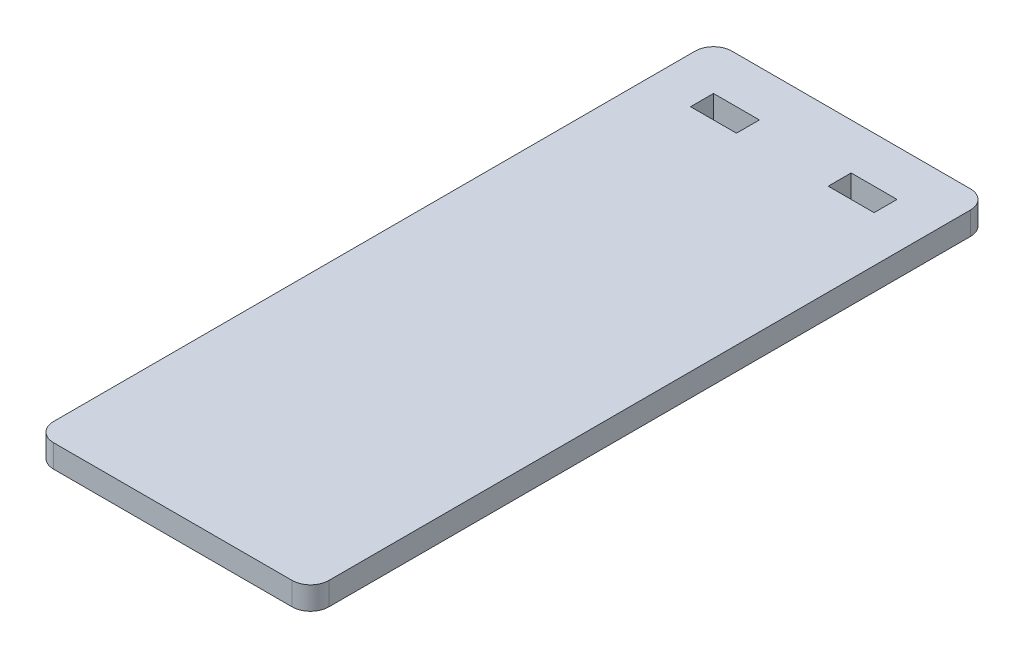
ISO-10303-21;
HEADER;
FILE_DESCRIPTION(('STEP AP214'),'2;1');
FILE_NAME('part.step','',(''),(''),'','','');
FILE_SCHEMA(('AUTOMOTIVE_DESIGN { 1 0 10303 214 1 1 1 1 }'));
ENDSEC;
DATA;
#1=APPLICATION_CONTEXT('core data for automotive mechanical design processes');
#2=APPLICATION_PROTOCOL_DEFINITION('international standard','automotive_design',2000,#1);
#3=PRODUCT_CONTEXT('',#1,'mechanical');
#4=PRODUCT('Part','Part','',(#3));
#5=PRODUCT_RELATED_PRODUCT_CATEGORY('part','',(#4));
#6=PRODUCT_DEFINITION_FORMATION('','',#4);
#7=PRODUCT_DEFINITION_CONTEXT('part definition',#1,'design');
#8=PRODUCT_DEFINITION('design','',#6,#7);
#9=PRODUCT_DEFINITION_SHAPE('','',#8);
#10=(LENGTH_UNIT() NAMED_UNIT(*) SI_UNIT(.MILLI.,.METRE.));
#11=(NAMED_UNIT(*) PLANE_ANGLE_UNIT() SI_UNIT($,.RADIAN.));
#12=(NAMED_UNIT(*) SI_UNIT($,.STERADIAN.) SOLID_ANGLE_UNIT());
#13=UNCERTAINTY_MEASURE_WITH_UNIT(LENGTH_MEASURE(1.E-05),#10,'distance_accuracy_value','');
#14=(GEOMETRIC_REPRESENTATION_CONTEXT(3) GLOBAL_UNCERTAINTY_ASSIGNED_CONTEXT((#13)) GLOBAL_UNIT_ASSIGNED_CONTEXT((#10,
#11,#12)) REPRESENTATION_CONTEXT('',''));
#15=CARTESIAN_POINT('',(0.,0.,0.));
#16=DIRECTION('',(0.,0.,1.));
#17=DIRECTION('',(1.,0.,0.));
#18=AXIS2_PLACEMENT_3D('',#15,#16,#17);
#19=CARTESIAN_POINT('',(0.,3.175,0.));
#20=DIRECTION('',(1.,0.,0.));
#21=DIRECTION('',(0.,0.,-1.));
#22=AXIS2_PLACEMENT_3D('',#19,#20,#21);
#23=PLANE('',#22);
#24=DIRECTION('',(0.,0.,1.));
#25=VECTOR('',#24,1.);
#26=CARTESIAN_POINT('',(0.,0.,0.));
#27=LINE('',#26,#25);
#28=CARTESIAN_POINT('',(0.,0.,-91.335));
#29=VERTEX_POINT('',#28);
#30=CARTESIAN_POINT('',(0.,0.,-2.54));
#31=VERTEX_POINT('',#30);
#32=EDGE_CURVE('E208',#29,#31,#27,.T.);
#33=ORIENTED_EDGE('',*,*,#32,.T.);
#34=DIRECTION('',(0.,-1.,0.));
#35=VECTOR('',#34,1.);
#36=CARTESIAN_POINT('',(0.,3.175,-2.54));
#37=LINE('',#36,#35);
#38=CARTESIAN_POINT('',(0.,3.175,-2.54));
#39=VERTEX_POINT('',#38);
#40=EDGE_CURVE('E326',#31,#39,#37,.F.);
#41=ORIENTED_EDGE('',*,*,#40,.T.);
#42=DIRECTION('',(0.,0.,1.));
#43=VECTOR('',#42,1.);
#44=CARTESIAN_POINT('',(0.,3.175,0.));
#45=LINE('',#44,#43);
#46=CARTESIAN_POINT('',(0.,3.175,-91.335));
#47=VERTEX_POINT('',#46);
#48=EDGE_CURVE('E257',#47,#39,#45,.T.);
#49=ORIENTED_EDGE('',*,*,#48,.F.);
#50=DIRECTION('',(0.,-1.,0.));
#51=VECTOR('',#50,1.);
#52=CARTESIAN_POINT('',(0.,3.175,-91.335));
#53=LINE('',#52,#51);
#54=EDGE_CURVE('E322',#47,#29,#53,.T.);
#55=ORIENTED_EDGE('',*,*,#54,.T.);
#56=EDGE_LOOP('',(#33,#41,#49,#55));
#57=FACE_BOUND('',#56,.T.);
#58=ADVANCED_FACE('F42',(#57),#23,.F.);
#59=CARTESIAN_POINT('',(0.,3.175,0.));
#60=DIRECTION('',(0.,0.,-1.));
#61=DIRECTION('',(-1.,0.,0.));
#62=AXIS2_PLACEMENT_3D('',#59,#60,#61);
#63=PLANE('',#62);
#64=DIRECTION('',(1.,0.,0.));
#65=VECTOR('',#64,1.);
#66=CARTESIAN_POINT('',(0.,0.,0.));
#67=LINE('',#66,#65);
#68=CARTESIAN_POINT('',(2.54,0.,0.));
#69=VERTEX_POINT('',#68);
#70=CARTESIAN_POINT('',(35.56,0.,0.));
#71=VERTEX_POINT('',#70);
#72=EDGE_CURVE('E276',#69,#71,#67,.T.);
#73=ORIENTED_EDGE('',*,*,#72,.T.);
#74=DIRECTION('',(0.,-1.,0.));
#75=VECTOR('',#74,1.);
#76=CARTESIAN_POINT('',(35.56,3.175,0.));
#77=LINE('',#76,#75);
#78=CARTESIAN_POINT('',(35.56,3.175,0.));
#79=VERTEX_POINT('',#78);
#80=EDGE_CURVE('E308',#71,#79,#77,.F.);
#81=ORIENTED_EDGE('',*,*,#80,.T.);
#82=DIRECTION('',(1.,0.,0.));
#83=VECTOR('',#82,1.);
#84=CARTESIAN_POINT('',(0.,3.175,0.));
#85=LINE('',#84,#83);
#86=CARTESIAN_POINT('',(2.54,3.175,0.));
#87=VERTEX_POINT('',#86);
#88=EDGE_CURVE('E261',#87,#79,#85,.T.);
#89=ORIENTED_EDGE('',*,*,#88,.F.);
#90=DIRECTION('',(0.,-1.,0.));
#91=VECTOR('',#90,1.);
#92=CARTESIAN_POINT('',(2.54,3.175,0.));
#93=LINE('',#92,#91);
#94=EDGE_CURVE('E304',#87,#69,#93,.T.);
#95=ORIENTED_EDGE('',*,*,#94,.T.);
#96=EDGE_LOOP('',(#73,#81,#89,#95));
#97=FACE_BOUND('',#96,.T.);
#98=ADVANCED_FACE('F343',(#97),#63,.F.);
#99=CARTESIAN_POINT('',(38.1,3.175,0.));
#100=DIRECTION('',(-1.,0.,0.));
#101=DIRECTION('',(0.,0.,1.));
#102=AXIS2_PLACEMENT_3D('',#99,#100,#101);
#103=PLANE('',#102);
#104=DIRECTION('',(0.,0.,-1.));
#105=VECTOR('',#104,1.);
#106=CARTESIAN_POINT('',(38.1,3.175,0.));
#107=LINE('',#106,#105);
#108=CARTESIAN_POINT('',(38.1,3.175,-2.54));
#109=VERTEX_POINT('',#108);
#110=CARTESIAN_POINT('',(38.1,3.175,-91.335));
#111=VERTEX_POINT('',#110);
#112=EDGE_CURVE('E266',#109,#111,#107,.T.);
#113=ORIENTED_EDGE('',*,*,#112,.F.);
#114=DIRECTION('',(0.,-1.,0.));
#115=VECTOR('',#114,1.);
#116=CARTESIAN_POINT('',(38.1,3.175,-2.54));
#117=LINE('',#116,#115);
#118=CARTESIAN_POINT('',(38.1,0.,-2.54));
#119=VERTEX_POINT('',#118);
#120=EDGE_CURVE('E288',#109,#119,#117,.T.);
#121=ORIENTED_EDGE('',*,*,#120,.T.);
#122=DIRECTION('',(0.,0.,-1.));
#123=VECTOR('',#122,1.);
#124=CARTESIAN_POINT('',(38.1,0.,0.));
#125=LINE('',#124,#123);
#126=CARTESIAN_POINT('',(38.1,0.,-91.335));
#127=VERTEX_POINT('',#126);
#128=EDGE_CURVE('E280',#119,#127,#125,.T.);
#129=ORIENTED_EDGE('',*,*,#128,.T.);
#130=DIRECTION('',(0.,-1.,0.));
#131=VECTOR('',#130,1.);
#132=CARTESIAN_POINT('',(38.1,3.175,-91.335));
#133=LINE('',#132,#131);
#134=EDGE_CURVE('E272',#127,#111,#133,.F.);
#135=ORIENTED_EDGE('',*,*,#134,.T.);
#136=EDGE_LOOP('',(#113,#121,#129,#135));
#137=FACE_BOUND('',#136,.T.);
#138=ADVANCED_FACE('F353',(#137),#103,.F.);
#139=CARTESIAN_POINT('',(0.,3.175,-93.875));
#140=DIRECTION('',(0.,0.,1.));
#141=DIRECTION('',(1.,0.,0.));
#142=AXIS2_PLACEMENT_3D('',#139,#140,#141);
#143=PLANE('',#142);
#144=DIRECTION('',(-1.,0.,0.));
#145=VECTOR('',#144,1.);
#146=CARTESIAN_POINT('',(0.,3.175,-93.875));
#147=LINE('',#146,#145);
#148=CARTESIAN_POINT('',(35.56,3.175,-93.875));
#149=VERTEX_POINT('',#148);
#150=CARTESIAN_POINT('',(2.54,3.175,-93.875));
#151=VERTEX_POINT('',#150);
#152=EDGE_CURVE('E269',#149,#151,#147,.T.);
#153=ORIENTED_EDGE('',*,*,#152,.F.);
#154=DIRECTION('',(0.,-1.,0.));
#155=VECTOR('',#154,1.);
#156=CARTESIAN_POINT('',(35.56,3.175,-93.875));
#157=LINE('',#156,#155);
#158=CARTESIAN_POINT('',(35.56,0.,-93.875));
#159=VERTEX_POINT('',#158);
#160=EDGE_CURVE('E11',#149,#159,#157,.T.);
#161=ORIENTED_EDGE('',*,*,#160,.T.);
#162=DIRECTION('',(-1.,0.,0.));
#163=VECTOR('',#162,1.);
#164=CARTESIAN_POINT('',(0.,0.,-93.875));
#165=LINE('',#164,#163);
#166=CARTESIAN_POINT('',(2.54,0.,-93.875));
#167=VERTEX_POINT('',#166);
#168=EDGE_CURVE('E262',#159,#167,#165,.T.);
#169=ORIENTED_EDGE('',*,*,#168,.T.);
#170=DIRECTION('',(0.,-1.,0.));
#171=VECTOR('',#170,1.);
#172=CARTESIAN_POINT('',(2.54,3.175,-93.875));
#173=LINE('',#172,#171);
#174=EDGE_CURVE('E51',#167,#151,#173,.F.);
#175=ORIENTED_EDGE('',*,*,#174,.T.);
#176=EDGE_LOOP('',(#153,#161,#169,#175));
#177=FACE_BOUND('',#176,.T.);
#178=ADVANCED_FACE('F359',(#177),#143,.F.);
#179=CARTESIAN_POINT('',(0.,3.175,0.));
#180=DIRECTION('',(0.,-1.,0.));
#181=DIRECTION('',(0.,0.,-1.));
#182=AXIS2_PLACEMENT_3D('',#179,#180,#181);
#183=PLANE('',#182);
#184=DIRECTION('',(1.,0.,0.));
#185=VECTOR('',#184,1.);
#186=CARTESIAN_POINT('',(6.35,3.175,-84.35));
#187=LINE('',#186,#185);
#188=CARTESIAN_POINT('',(6.35,3.175,-84.35));
#189=VERTEX_POINT('',#188);
#190=CARTESIAN_POINT('',(12.7,3.175,-84.35));
#191=VERTEX_POINT('',#190);
#192=EDGE_CURVE('E198',#189,#191,#187,.T.);
#193=ORIENTED_EDGE('',*,*,#192,.F.);
#194=DIRECTION('',(0.,0.,1.));
#195=VECTOR('',#194,1.);
#196=CARTESIAN_POINT('',(6.35,3.175,-87.525));
#197=LINE('',#196,#195);
#198=CARTESIAN_POINT('',(6.35,3.175,-87.525));
#199=VERTEX_POINT('',#198);
#200=EDGE_CURVE('E164',#199,#189,#197,.T.);
#201=ORIENTED_EDGE('',*,*,#200,.F.);
#202=DIRECTION('',(-1.,0.,0.));
#203=VECTOR('',#202,1.);
#204=CARTESIAN_POINT('',(6.35,3.175,-87.525));
#205=LINE('',#204,#203);
#206=CARTESIAN_POINT('',(12.7,3.175,-87.525));
#207=VERTEX_POINT('',#206);
#208=EDGE_CURVE('E185',#207,#199,#205,.T.);
#209=ORIENTED_EDGE('',*,*,#208,.F.);
#210=DIRECTION('',(0.,0.,-1.));
#211=VECTOR('',#210,1.);
#212=CARTESIAN_POINT('',(12.7,3.175,-87.525));
#213=LINE('',#212,#211);
#214=EDGE_CURVE('E189',#191,#207,#213,.T.);
#215=ORIENTED_EDGE('',*,*,#214,.F.);
#216=EDGE_LOOP('',(#193,#201,#209,#215));
#217=FACE_BOUND('',#216,.T.);
#218=DIRECTION('',(1.,0.,0.));
#219=VECTOR('',#218,1.);
#220=CARTESIAN_POINT('',(25.4,3.175,-84.35));
#221=LINE('',#220,#219);
#222=CARTESIAN_POINT('',(25.4,3.175,-84.35));
#223=VERTEX_POINT('',#222);
#224=CARTESIAN_POINT('',(31.75,3.175,-84.35));
#225=VERTEX_POINT('',#224);
#226=EDGE_CURVE('E237',#223,#225,#221,.T.);
#227=ORIENTED_EDGE('',*,*,#226,.F.);
#228=DIRECTION('',(0.,0.,1.));
#229=VECTOR('',#228,1.);
#230=CARTESIAN_POINT('',(25.4,3.175,-84.35));
#231=LINE('',#230,#229);
#232=CARTESIAN_POINT('',(25.4,3.175,-87.525));
#233=VERTEX_POINT('',#232);
#234=EDGE_CURVE('E199',#233,#223,#231,.T.);
#235=ORIENTED_EDGE('',*,*,#234,.F.);
#236=DIRECTION('',(-1.,0.,0.));
#237=VECTOR('',#236,1.);
#238=CARTESIAN_POINT('',(25.4,3.175,-87.525));
#239=LINE('',#238,#237);
#240=CARTESIAN_POINT('',(31.75,3.175,-87.525));
#241=VERTEX_POINT('',#240);
#242=EDGE_CURVE('E228',#241,#233,#239,.T.);
#243=ORIENTED_EDGE('',*,*,#242,.F.);
#244=DIRECTION('',(0.,0.,-1.));
#245=VECTOR('',#244,1.);
#246=CARTESIAN_POINT('',(31.75,3.175,-84.35));
#247=LINE('',#246,#245);
#248=EDGE_CURVE('E232',#225,#241,#247,.T.);
#249=ORIENTED_EDGE('',*,*,#248,.F.);
#250=EDGE_LOOP('',(#227,#235,#243,#249));
#251=FACE_BOUND('',#250,.T.);
#252=ORIENTED_EDGE('',*,*,#88,.T.);
#253=CARTESIAN_POINT('',(35.56,3.175,-2.54));
#254=DIRECTION('',(0.,-1.,0.));
#255=DIRECTION('',(0.,0.,-1.));
#256=AXIS2_PLACEMENT_3D('',#253,#254,#255);
#257=CIRCLE('',#256,2.54);
#258=EDGE_CURVE('E319',#79,#109,#257,.F.);
#259=ORIENTED_EDGE('',*,*,#258,.T.);
#260=ORIENTED_EDGE('',*,*,#112,.T.);
#261=CARTESIAN_POINT('',(35.56,3.175,-91.335));
#262=DIRECTION('',(0.,-1.,0.));
#263=DIRECTION('',(0.,0.,-1.));
#264=AXIS2_PLACEMENT_3D('',#261,#262,#263);
#265=CIRCLE('',#264,2.54);
#266=EDGE_CURVE('E64',#111,#149,#265,.F.);
#267=ORIENTED_EDGE('',*,*,#266,.T.);
#268=ORIENTED_EDGE('',*,*,#152,.T.);
#269=CARTESIAN_POINT('',(2.54,3.175,-91.335));
#270=DIRECTION('',(0.,-1.,0.));
#271=DIRECTION('',(0.,0.,-1.));
#272=AXIS2_PLACEMENT_3D('',#269,#270,#271);
#273=CIRCLE('',#272,2.54);
#274=EDGE_CURVE('E311',#151,#47,#273,.F.);
#275=ORIENTED_EDGE('',*,*,#274,.T.);
#276=ORIENTED_EDGE('',*,*,#48,.T.);
#277=CARTESIAN_POINT('',(2.54,3.175,-2.54));
#278=DIRECTION('',(0.,-1.,0.));
#279=DIRECTION('',(0.,0.,-1.));
#280=AXIS2_PLACEMENT_3D('',#277,#278,#279);
#281=CIRCLE('',#280,2.54);
#282=EDGE_CURVE('E316',#39,#87,#281,.F.);
#283=ORIENTED_EDGE('',*,*,#282,.T.);
#284=EDGE_LOOP('',(#252,#259,#260,#267,#268,#275,#276,#283));
#285=FACE_BOUND('',#284,.T.);
#286=ADVANCED_FACE('F336',(#217,#251,#285),#183,.F.);
#287=CARTESIAN_POINT('',(0.,0.,0.));
#288=DIRECTION('',(0.,-1.,0.));
#289=DIRECTION('',(0.,0.,-1.));
#290=AXIS2_PLACEMENT_3D('',#287,#288,#289);
#291=PLANE('',#290);
#292=DIRECTION('',(0.,0.,1.));
#293=VECTOR('',#292,1.);
#294=CARTESIAN_POINT('',(6.35,0.,-87.525));
#295=LINE('',#294,#293);
#296=CARTESIAN_POINT('',(6.35,0.,-87.525));
#297=VERTEX_POINT('',#296);
#298=CARTESIAN_POINT('',(6.35,0.,-84.35));
#299=VERTEX_POINT('',#298);
#300=EDGE_CURVE('E161',#297,#299,#295,.T.);
#301=ORIENTED_EDGE('',*,*,#300,.T.);
#302=DIRECTION('',(1.,0.,0.));
#303=VECTOR('',#302,1.);
#304=CARTESIAN_POINT('',(6.35,0.,-84.35));
#305=LINE('',#304,#303);
#306=CARTESIAN_POINT('',(12.7,0.,-84.35));
#307=VERTEX_POINT('',#306);
#308=EDGE_CURVE('E174',#299,#307,#305,.T.);
#309=ORIENTED_EDGE('',*,*,#308,.T.);
#310=DIRECTION('',(0.,0.,-1.));
#311=VECTOR('',#310,1.);
#312=CARTESIAN_POINT('',(12.7,0.,-87.525));
#313=LINE('',#312,#311);
#314=CARTESIAN_POINT('',(12.7,0.,-87.525));
#315=VERTEX_POINT('',#314);
#316=EDGE_CURVE('E179',#307,#315,#313,.T.);
#317=ORIENTED_EDGE('',*,*,#316,.T.);
#318=DIRECTION('',(-1.,0.,0.));
#319=VECTOR('',#318,1.);
#320=CARTESIAN_POINT('',(6.35,0.,-87.525));
#321=LINE('',#320,#319);
#322=EDGE_CURVE('E170',#315,#297,#321,.T.);
#323=ORIENTED_EDGE('',*,*,#322,.T.);
#324=EDGE_LOOP('',(#301,#309,#317,#323));
#325=FACE_BOUND('',#324,.T.);
#326=DIRECTION('',(0.,0.,1.));
#327=VECTOR('',#326,1.);
#328=CARTESIAN_POINT('',(25.4,0.,-84.35));
#329=LINE('',#328,#327);
#330=CARTESIAN_POINT('',(25.4,0.,-87.525));
#331=VERTEX_POINT('',#330);
#332=CARTESIAN_POINT('',(25.4,0.,-84.35));
#333=VERTEX_POINT('',#332);
#334=EDGE_CURVE('E233',#331,#333,#329,.T.);
#335=ORIENTED_EDGE('',*,*,#334,.T.);
#336=DIRECTION('',(1.,0.,0.));
#337=VECTOR('',#336,1.);
#338=CARTESIAN_POINT('',(25.4,0.,-84.35));
#339=LINE('',#338,#337);
#340=CARTESIAN_POINT('',(31.75,0.,-84.35));
#341=VERTEX_POINT('',#340);
#342=EDGE_CURVE('E250',#333,#341,#339,.T.);
#343=ORIENTED_EDGE('',*,*,#342,.T.);
#344=DIRECTION('',(0.,0.,-1.));
#345=VECTOR('',#344,1.);
#346=CARTESIAN_POINT('',(31.75,0.,-84.35));
#347=LINE('',#346,#345);
#348=CARTESIAN_POINT('',(31.75,0.,-87.525));
#349=VERTEX_POINT('',#348);
#350=EDGE_CURVE('E246',#341,#349,#347,.T.);
#351=ORIENTED_EDGE('',*,*,#350,.T.);
#352=DIRECTION('',(-1.,0.,0.));
#353=VECTOR('',#352,1.);
#354=CARTESIAN_POINT('',(25.4,0.,-87.525));
#355=LINE('',#354,#353);
#356=EDGE_CURVE('E218',#349,#331,#355,.T.);
#357=ORIENTED_EDGE('',*,*,#356,.T.);
#358=EDGE_LOOP('',(#335,#343,#351,#357));
#359=FACE_BOUND('',#358,.T.);
#360=ORIENTED_EDGE('',*,*,#128,.F.);
#361=CARTESIAN_POINT('',(35.56,0.,-2.54));
#362=DIRECTION('',(0.,-1.,0.));
#363=DIRECTION('',(0.,0.,-1.));
#364=AXIS2_PLACEMENT_3D('',#361,#362,#363);
#365=CIRCLE('',#364,2.54);
#366=EDGE_CURVE('E301',#119,#71,#365,.T.);
#367=ORIENTED_EDGE('',*,*,#366,.T.);
#368=ORIENTED_EDGE('',*,*,#72,.F.);
#369=CARTESIAN_POINT('',(2.54,0.,-2.54));
#370=DIRECTION('',(0.,-1.,0.));
#371=DIRECTION('',(0.,0.,-1.));
#372=AXIS2_PLACEMENT_3D('',#369,#370,#371);
#373=CIRCLE('',#372,2.54);
#374=EDGE_CURVE('E298',#69,#31,#373,.T.);
#375=ORIENTED_EDGE('',*,*,#374,.T.);
#376=ORIENTED_EDGE('',*,*,#32,.F.);
#377=CARTESIAN_POINT('',(2.54,0.,-91.335));
#378=DIRECTION('',(0.,-1.,0.));
#379=DIRECTION('',(0.,0.,-1.));
#380=AXIS2_PLACEMENT_3D('',#377,#378,#379);
#381=CIRCLE('',#380,2.54);
#382=EDGE_CURVE('E292',#29,#167,#381,.T.);
#383=ORIENTED_EDGE('',*,*,#382,.T.);
#384=ORIENTED_EDGE('',*,*,#168,.F.);
#385=CARTESIAN_POINT('',(35.56,0.,-91.335));
#386=DIRECTION('',(0.,-1.,0.));
#387=DIRECTION('',(0.,0.,-1.));
#388=AXIS2_PLACEMENT_3D('',#385,#386,#387);
#389=CIRCLE('',#388,2.54);
#390=EDGE_CURVE('E295',#159,#127,#389,.T.);
#391=ORIENTED_EDGE('',*,*,#390,.T.);
#392=EDGE_LOOP('',(#360,#367,#368,#375,#376,#383,#384,#391));
#393=FACE_BOUND('',#392,.T.);
#394=ADVANCED_FACE('F181',(#325,#359,#393),#291,.T.);
#395=CARTESIAN_POINT('',(25.4,0.,-84.35));
#396=DIRECTION('',(-1.,0.,0.));
#397=DIRECTION('',(0.,0.,1.));
#398=AXIS2_PLACEMENT_3D('',#395,#396,#397);
#399=PLANE('',#398);
#400=ORIENTED_EDGE('',*,*,#234,.T.);
#401=DIRECTION('',(0.,1.,0.));
#402=VECTOR('',#401,1.);
#403=CARTESIAN_POINT('',(25.4,0.,-84.35));
#404=LINE('',#403,#402);
#405=EDGE_CURVE('E214',#333,#223,#404,.T.);
#406=ORIENTED_EDGE('',*,*,#405,.F.);
#407=ORIENTED_EDGE('',*,*,#334,.F.);
#408=DIRECTION('',(0.,1.,0.));
#409=VECTOR('',#408,1.);
#410=CARTESIAN_POINT('',(25.4,0.,-87.525));
#411=LINE('',#410,#409);
#412=EDGE_CURVE('E225',#331,#233,#411,.T.);
#413=ORIENTED_EDGE('',*,*,#412,.T.);
#414=EDGE_LOOP('',(#400,#406,#407,#413));
#415=FACE_BOUND('',#414,.T.);
#416=ADVANCED_FACE('F467',(#415),#399,.F.);
#417=CARTESIAN_POINT('',(25.4,0.,-87.525));
#418=DIRECTION('',(0.,0.,-1.));
#419=DIRECTION('',(-1.,0.,0.));
#420=AXIS2_PLACEMENT_3D('',#417,#418,#419);
#421=PLANE('',#420);
#422=ORIENTED_EDGE('',*,*,#242,.T.);
#423=ORIENTED_EDGE('',*,*,#412,.F.);
#424=ORIENTED_EDGE('',*,*,#356,.F.);
#425=DIRECTION('',(0.,1.,0.));
#426=VECTOR('',#425,1.);
#427=CARTESIAN_POINT('',(31.75,0.,-87.525));
#428=LINE('',#427,#426);
#429=EDGE_CURVE('E222',#349,#241,#428,.T.);
#430=ORIENTED_EDGE('',*,*,#429,.T.);
#431=EDGE_LOOP('',(#422,#423,#424,#430));
#432=FACE_BOUND('',#431,.T.);
#433=ADVANCED_FACE('F457',(#432),#421,.F.);
#434=CARTESIAN_POINT('',(31.75,0.,-84.35));
#435=DIRECTION('',(1.,0.,0.));
#436=DIRECTION('',(0.,0.,-1.));
#437=AXIS2_PLACEMENT_3D('',#434,#435,#436);
#438=PLANE('',#437);
#439=ORIENTED_EDGE('',*,*,#248,.T.);
#440=ORIENTED_EDGE('',*,*,#429,.F.);
#441=ORIENTED_EDGE('',*,*,#350,.F.);
#442=DIRECTION('',(0.,1.,0.));
#443=VECTOR('',#442,1.);
#444=CARTESIAN_POINT('',(31.75,0.,-84.35));
#445=LINE('',#444,#443);
#446=EDGE_CURVE('E219',#341,#225,#445,.T.);
#447=ORIENTED_EDGE('',*,*,#446,.T.);
#448=EDGE_LOOP('',(#439,#440,#441,#447));
#449=FACE_BOUND('',#448,.T.);
#450=ADVANCED_FACE('F447',(#449),#438,.F.);
#451=CARTESIAN_POINT('',(25.4,0.,-84.35));
#452=DIRECTION('',(0.,0.,1.));
#453=DIRECTION('',(1.,0.,0.));
#454=AXIS2_PLACEMENT_3D('',#451,#452,#453);
#455=PLANE('',#454);
#456=ORIENTED_EDGE('',*,*,#226,.T.);
#457=ORIENTED_EDGE('',*,*,#446,.F.);
#458=ORIENTED_EDGE('',*,*,#342,.F.);
#459=ORIENTED_EDGE('',*,*,#405,.T.);
#460=EDGE_LOOP('',(#456,#457,#458,#459));
#461=FACE_BOUND('',#460,.T.);
#462=ADVANCED_FACE('F438',(#461),#455,.F.);
#463=CARTESIAN_POINT('',(6.35,0.,-87.525));
#464=DIRECTION('',(-1.,0.,0.));
#465=DIRECTION('',(0.,0.,1.));
#466=AXIS2_PLACEMENT_3D('',#463,#464,#465);
#467=PLANE('',#466);
#468=ORIENTED_EDGE('',*,*,#200,.T.);
#469=DIRECTION('',(0.,1.,0.));
#470=VECTOR('',#469,1.);
#471=CARTESIAN_POINT('',(6.35,0.,-84.35));
#472=LINE('',#471,#470);
#473=EDGE_CURVE('E157',#299,#189,#472,.T.);
#474=ORIENTED_EDGE('',*,*,#473,.F.);
#475=ORIENTED_EDGE('',*,*,#300,.F.);
#476=DIRECTION('',(0.,1.,0.));
#477=VECTOR('',#476,1.);
#478=CARTESIAN_POINT('',(6.35,0.,-87.525));
#479=LINE('',#478,#477);
#480=EDGE_CURVE('E205',#297,#199,#479,.T.);
#481=ORIENTED_EDGE('',*,*,#480,.T.);
#482=EDGE_LOOP('',(#468,#474,#475,#481));
#483=FACE_BOUND('',#482,.T.);
#484=ADVANCED_FACE('F159',(#483),#467,.F.);
#485=CARTESIAN_POINT('',(6.35,0.,-87.525));
#486=DIRECTION('',(0.,0.,-1.));
#487=DIRECTION('',(-1.,0.,0.));
#488=AXIS2_PLACEMENT_3D('',#485,#486,#487);
#489=PLANE('',#488);
#490=ORIENTED_EDGE('',*,*,#208,.T.);
#491=ORIENTED_EDGE('',*,*,#480,.F.);
#492=ORIENTED_EDGE('',*,*,#322,.F.);
#493=DIRECTION('',(0.,1.,0.));
#494=VECTOR('',#493,1.);
#495=CARTESIAN_POINT('',(12.7,0.,-87.525));
#496=LINE('',#495,#494);
#497=EDGE_CURVE('E209',#315,#207,#496,.T.);
#498=ORIENTED_EDGE('',*,*,#497,.T.);
#499=EDGE_LOOP('',(#490,#491,#492,#498));
#500=FACE_BOUND('',#499,.T.);
#501=ADVANCED_FACE('F419',(#500),#489,.F.);
#502=CARTESIAN_POINT('',(12.7,0.,-87.525));
#503=DIRECTION('',(1.,0.,0.));
#504=DIRECTION('',(0.,0.,-1.));
#505=AXIS2_PLACEMENT_3D('',#502,#503,#504);
#506=PLANE('',#505);
#507=ORIENTED_EDGE('',*,*,#214,.T.);
#508=ORIENTED_EDGE('',*,*,#497,.F.);
#509=ORIENTED_EDGE('',*,*,#316,.F.);
#510=DIRECTION('',(0.,1.,0.));
#511=VECTOR('',#510,1.);
#512=CARTESIAN_POINT('',(12.7,0.,-84.35));
#513=LINE('',#512,#511);
#514=EDGE_CURVE('E169',#307,#191,#513,.T.);
#515=ORIENTED_EDGE('',*,*,#514,.T.);
#516=EDGE_LOOP('',(#507,#508,#509,#515));
#517=FACE_BOUND('',#516,.T.);
#518=ADVANCED_FACE('F410',(#517),#506,.F.);
#519=CARTESIAN_POINT('',(6.35,0.,-84.35));
#520=DIRECTION('',(0.,0.,1.));
#521=DIRECTION('',(1.,0.,0.));
#522=AXIS2_PLACEMENT_3D('',#519,#520,#521);
#523=PLANE('',#522);
#524=ORIENTED_EDGE('',*,*,#192,.T.);
#525=ORIENTED_EDGE('',*,*,#514,.F.);
#526=ORIENTED_EDGE('',*,*,#308,.F.);
#527=ORIENTED_EDGE('',*,*,#473,.T.);
#528=EDGE_LOOP('',(#524,#525,#526,#527));
#529=FACE_BOUND('',#528,.T.);
#530=ADVANCED_FACE('F175',(#529),#523,.F.);
#531=CARTESIAN_POINT('',(35.56,3.175,-2.54));
#532=DIRECTION('',(0.,-1.,0.));
#533=DIRECTION('',(0.,0.,-1.));
#534=AXIS2_PLACEMENT_3D('',#531,#532,#533);
#535=CYLINDRICAL_SURFACE('',#534,2.54);
#536=ORIENTED_EDGE('',*,*,#258,.F.);
#537=ORIENTED_EDGE('',*,*,#80,.F.);
#538=ORIENTED_EDGE('',*,*,#366,.F.);
#539=ORIENTED_EDGE('',*,*,#120,.F.);
#540=EDGE_LOOP('',(#536,#537,#538,#539));
#541=FACE_BOUND('',#540,.T.);
#542=ADVANCED_FACE('F350',(#541),#535,.T.);
#543=CARTESIAN_POINT('',(2.54,3.175,-2.54));
#544=DIRECTION('',(0.,-1.,0.));
#545=DIRECTION('',(0.,0.,-1.));
#546=AXIS2_PLACEMENT_3D('',#543,#544,#545);
#547=CYLINDRICAL_SURFACE('',#546,2.54);
#548=ORIENTED_EDGE('',*,*,#282,.F.);
#549=ORIENTED_EDGE('',*,*,#40,.F.);
#550=ORIENTED_EDGE('',*,*,#374,.F.);
#551=ORIENTED_EDGE('',*,*,#94,.F.);
#552=EDGE_LOOP('',(#548,#549,#550,#551));
#553=FACE_BOUND('',#552,.T.);
#554=ADVANCED_FACE('F340',(#553),#547,.T.);
#555=CARTESIAN_POINT('',(35.56,3.175,-91.335));
#556=DIRECTION('',(0.,-1.,0.));
#557=DIRECTION('',(0.,0.,-1.));
#558=AXIS2_PLACEMENT_3D('',#555,#556,#557);
#559=CYLINDRICAL_SURFACE('',#558,2.54);
#560=ORIENTED_EDGE('',*,*,#266,.F.);
#561=ORIENTED_EDGE('',*,*,#134,.F.);
#562=ORIENTED_EDGE('',*,*,#390,.F.);
#563=ORIENTED_EDGE('',*,*,#160,.F.);
#564=EDGE_LOOP('',(#560,#561,#562,#563));
#565=FACE_BOUND('',#564,.T.);
#566=ADVANCED_FACE('F357',(#565),#559,.T.);
#567=CARTESIAN_POINT('',(2.54,3.175,-91.335));
#568=DIRECTION('',(0.,-1.,0.));
#569=DIRECTION('',(0.,0.,-1.));
#570=AXIS2_PLACEMENT_3D('',#567,#568,#569);
#571=CYLINDRICAL_SURFACE('',#570,2.54);
#572=ORIENTED_EDGE('',*,*,#274,.F.);
#573=ORIENTED_EDGE('',*,*,#174,.F.);
#574=ORIENTED_EDGE('',*,*,#382,.F.);
#575=ORIENTED_EDGE('',*,*,#54,.F.);
#576=EDGE_LOOP('',(#572,#573,#574,#575));
#577=FACE_BOUND('',#576,.T.);
#578=ADVANCED_FACE('F44',(#577),#571,.T.);
#579=CLOSED_SHELL('',(#58,#98,#138,#178,#286,#394,#416,#433,#450,#462,#484,#501,#518,#530,#542,
#554,#566,#578));
#580=MANIFOLD_SOLID_BREP('B2',#579);
#581=ADVANCED_BREP_SHAPE_REPRESENTATION('',(#18,#580),#14);
#582=SHAPE_DEFINITION_REPRESENTATION(#9,#581);
ENDSEC;
END-ISO-10303-21;
